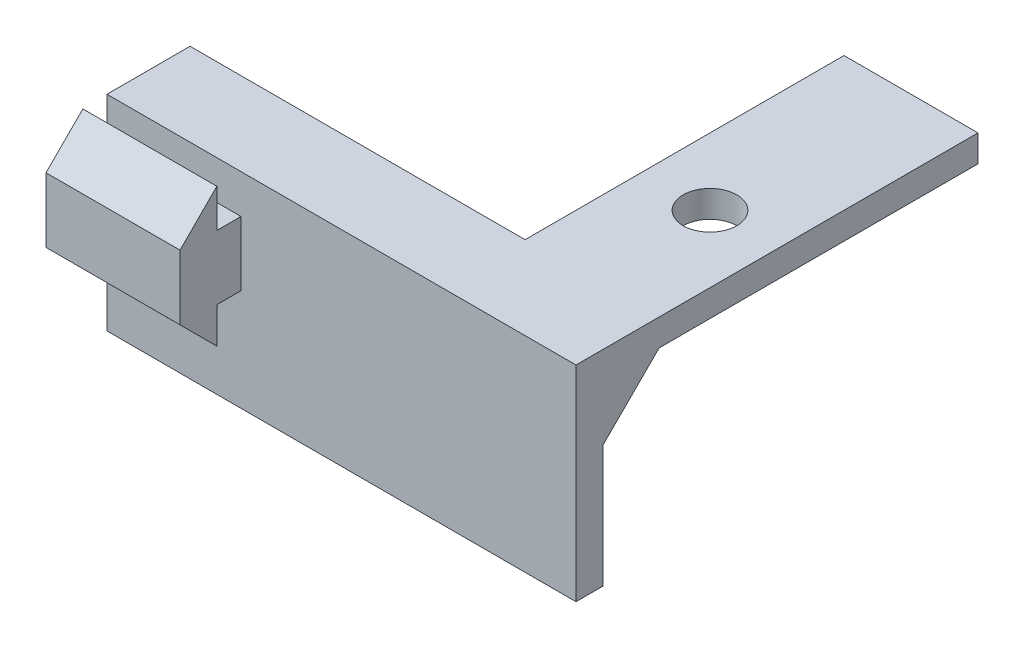
ISO-10303-21;
HEADER;
FILE_DESCRIPTION(('STEP AP214'),'2;1');
FILE_NAME('part.step','',(''),(''),'','','');
FILE_SCHEMA(('AUTOMOTIVE_DESIGN { 1 0 10303 214 1 1 1 1 }'));
ENDSEC;
DATA;
#1=APPLICATION_CONTEXT('core data for automotive mechanical design processes');
#2=APPLICATION_PROTOCOL_DEFINITION('international standard','automotive_design',2000,#1);
#3=PRODUCT_CONTEXT('',#1,'mechanical');
#4=PRODUCT('Part','Part','',(#3));
#5=PRODUCT_RELATED_PRODUCT_CATEGORY('part','',(#4));
#6=PRODUCT_DEFINITION_FORMATION('','',#4);
#7=PRODUCT_DEFINITION_CONTEXT('part definition',#1,'design');
#8=PRODUCT_DEFINITION('design','',#6,#7);
#9=PRODUCT_DEFINITION_SHAPE('','',#8);
#10=(LENGTH_UNIT() NAMED_UNIT(*) SI_UNIT(.MILLI.,.METRE.));
#11=(NAMED_UNIT(*) PLANE_ANGLE_UNIT() SI_UNIT($,.RADIAN.));
#12=(NAMED_UNIT(*) SI_UNIT($,.STERADIAN.) SOLID_ANGLE_UNIT());
#13=UNCERTAINTY_MEASURE_WITH_UNIT(LENGTH_MEASURE(1.E-05),#10,'distance_accuracy_value','');
#14=(GEOMETRIC_REPRESENTATION_CONTEXT(3) GLOBAL_UNCERTAINTY_ASSIGNED_CONTEXT((#13)) GLOBAL_UNIT_ASSIGNED_CONTEXT((#10,
#11,#12)) REPRESENTATION_CONTEXT('',''));
#15=CARTESIAN_POINT('',(0.,0.,0.));
#16=DIRECTION('',(0.,0.,1.));
#17=DIRECTION('',(1.,0.,0.));
#18=AXIS2_PLACEMENT_3D('',#15,#16,#17);
#19=CARTESIAN_POINT('',(-25.,7.60000000000001,0.));
#20=DIRECTION('',(0.,-1.,0.));
#21=DIRECTION('',(0.,0.,-1.));
#22=AXIS2_PLACEMENT_3D('',#19,#20,#21);
#23=PLANE('',#22);
#24=DIRECTION('',(1.,0.,0.));
#25=VECTOR('',#24,1.);
#26=CARTESIAN_POINT('',(-25.,7.60000000000001,0.));
#27=LINE('',#26,#25);
#28=CARTESIAN_POINT('',(-25.,7.60000000000001,0.));
#29=VERTEX_POINT('',#28);
#30=CARTESIAN_POINT('',(-15.,7.60000000000001,0.));
#31=VERTEX_POINT('',#30);
#32=EDGE_CURVE('E158',#29,#31,#27,.T.);
#33=ORIENTED_EDGE('',*,*,#32,.T.);
#34=DIRECTION('',(0.,0.,-1.));
#35=VECTOR('',#34,1.);
#36=CARTESIAN_POINT('',(-15.,7.60000000000001,0.));
#37=LINE('',#36,#35);
#38=CARTESIAN_POINT('',(-15.,7.60000000000001,1.8));
#39=VERTEX_POINT('',#38);
#40=EDGE_CURVE('E313',#39,#31,#37,.T.);
#41=ORIENTED_EDGE('',*,*,#40,.F.);
#42=DIRECTION('',(1.,0.,0.));
#43=VECTOR('',#42,1.);
#44=CARTESIAN_POINT('',(-25.,7.60000000000001,1.8));
#45=LINE('',#44,#43);
#46=CARTESIAN_POINT('',(-25.,7.60000000000001,1.8));
#47=VERTEX_POINT('',#46);
#48=EDGE_CURVE('E155',#47,#39,#45,.T.);
#49=ORIENTED_EDGE('',*,*,#48,.F.);
#50=DIRECTION('',(0.,0.,-1.));
#51=VECTOR('',#50,1.);
#52=CARTESIAN_POINT('',(-25.,7.60000000000001,0.));
#53=LINE('',#52,#51);
#54=EDGE_CURVE('E294',#47,#29,#53,.T.);
#55=ORIENTED_EDGE('',*,*,#54,.T.);
#56=EDGE_LOOP('',(#33,#41,#49,#55));
#57=FACE_BOUND('',#56,.T.);
#58=ADVANCED_FACE('F35',(#57),#23,.T.);
#59=CARTESIAN_POINT('',(-25.,0.,1.8));
#60=DIRECTION('',(0.,0.,1.));
#61=DIRECTION('',(0.,-1.,0.));
#62=AXIS2_PLACEMENT_3D('',#59,#60,#61);
#63=PLANE('',#62);
#64=DIRECTION('',(0.,-1.,0.));
#65=VECTOR('',#64,1.);
#66=CARTESIAN_POINT('',(-15.,0.,1.8));
#67=LINE('',#66,#65);
#68=CARTESIAN_POINT('',(-15.,4.92168062195145,1.8));
#69=VERTEX_POINT('',#68);
#70=EDGE_CURVE('E501',#39,#69,#67,.T.);
#71=ORIENTED_EDGE('',*,*,#70,.T.);
#72=DIRECTION('',(1.,0.,0.));
#73=VECTOR('',#72,1.);
#74=CARTESIAN_POINT('',(-25.,4.92168062195145,1.8));
#75=LINE('',#74,#73);
#76=CARTESIAN_POINT('',(-25.,4.92168062195145,1.8));
#77=VERTEX_POINT('',#76);
#78=EDGE_CURVE('E159',#77,#69,#75,.T.);
#79=ORIENTED_EDGE('',*,*,#78,.F.);
#80=DIRECTION('',(0.,-1.,0.));
#81=VECTOR('',#80,1.);
#82=CARTESIAN_POINT('',(-25.,0.,1.8));
#83=LINE('',#82,#81);
#84=EDGE_CURVE('E291',#47,#77,#83,.T.);
#85=ORIENTED_EDGE('',*,*,#84,.F.);
#86=ORIENTED_EDGE('',*,*,#48,.T.);
#87=EDGE_LOOP('',(#71,#79,#85,#86));
#88=FACE_BOUND('',#87,.T.);
#89=ADVANCED_FACE('F221',(#88),#63,.F.);
#90=CARTESIAN_POINT('',(-25.,1.56084031097572,-1.56084031097572));
#91=DIRECTION('',(0.,0.707106781186548,-0.707106781186548));
#92=DIRECTION('',(0.,0.707106781186548,0.707106781186548));
#93=AXIS2_PLACEMENT_3D('',#90,#91,#92);
#94=PLANE('',#93);
#95=DIRECTION('',(0.,0.707106781186548,0.707106781186548));
#96=VECTOR('',#95,1.);
#97=CARTESIAN_POINT('',(-15.,1.56084031097572,-1.56084031097572));
#98=LINE('',#97,#96);
#99=CARTESIAN_POINT('',(-15.,7.6716806219514,4.54999999999995));
#100=VERTEX_POINT('',#99);
#101=EDGE_CURVE('E148',#69,#100,#98,.T.);
#102=ORIENTED_EDGE('',*,*,#101,.T.);
#103=DIRECTION('',(1.,0.,0.));
#104=VECTOR('',#103,1.);
#105=CARTESIAN_POINT('',(-25.,7.6716806219514,4.54999999999995));
#106=LINE('',#105,#104);
#107=CARTESIAN_POINT('',(-25.,7.6716806219514,4.54999999999995));
#108=VERTEX_POINT('',#107);
#109=EDGE_CURVE('E162',#108,#100,#106,.T.);
#110=ORIENTED_EDGE('',*,*,#109,.F.);
#111=DIRECTION('',(0.,0.707106781186548,0.707106781186548));
#112=VECTOR('',#111,1.);
#113=CARTESIAN_POINT('',(-25.,1.56084031097572,-1.56084031097572));
#114=LINE('',#113,#112);
#115=EDGE_CURVE('E288',#77,#108,#114,.T.);
#116=ORIENTED_EDGE('',*,*,#115,.F.);
#117=ORIENTED_EDGE('',*,*,#78,.T.);
#118=EDGE_LOOP('',(#102,#110,#116,#117));
#119=FACE_BOUND('',#118,.T.);
#120=ADVANCED_FACE('F227',(#119),#94,.F.);
#121=CARTESIAN_POINT('',(-25.,0.,4.54999999999995));
#122=DIRECTION('',(0.,0.,1.));
#123=DIRECTION('',(0.,-1.,0.));
#124=AXIS2_PLACEMENT_3D('',#121,#122,#123);
#125=PLANE('',#124);
#126=ORIENTED_EDGE('',*,*,#109,.T.);
#127=DIRECTION('',(0.,-1.,0.));
#128=VECTOR('',#127,1.);
#129=CARTESIAN_POINT('',(-15.,0.,4.54999999999995));
#130=LINE('',#129,#128);
#131=CARTESIAN_POINT('',(-15.,12.5,4.54999999999996));
#132=VERTEX_POINT('',#131);
#133=EDGE_CURVE('E518',#132,#100,#130,.T.);
#134=ORIENTED_EDGE('',*,*,#133,.F.);
#135=DIRECTION('',(1.,0.,0.));
#136=VECTOR('',#135,1.);
#137=CARTESIAN_POINT('',(-25.,12.5,4.54999999999996));
#138=LINE('',#137,#136);
#139=CARTESIAN_POINT('',(-25.,12.5,4.54999999999996));
#140=VERTEX_POINT('',#139);
#141=EDGE_CURVE('E165',#140,#132,#138,.T.);
#142=ORIENTED_EDGE('',*,*,#141,.F.);
#143=DIRECTION('',(0.,-1.,0.));
#144=VECTOR('',#143,1.);
#145=CARTESIAN_POINT('',(-25.,0.,4.54999999999995));
#146=LINE('',#145,#144);
#147=EDGE_CURVE('E285',#140,#108,#146,.T.);
#148=ORIENTED_EDGE('',*,*,#147,.T.);
#149=EDGE_LOOP('',(#126,#134,#142,#148));
#150=FACE_BOUND('',#149,.T.);
#151=ADVANCED_FACE('F237',(#150),#125,.T.);
#152=CARTESIAN_POINT('',(-25.,8.52499999999992,8.52500000000001));
#153=DIRECTION('',(0.,0.707106781186544,0.707106781186551));
#154=DIRECTION('',(0.,-0.707106781186551,0.707106781186544));
#155=AXIS2_PLACEMENT_3D('',#152,#153,#154);
#156=PLANE('',#155);
#157=ORIENTED_EDGE('',*,*,#141,.T.);
#158=DIRECTION('',(0.,-0.707106781186551,0.707106781186544));
#159=VECTOR('',#158,1.);
#160=CARTESIAN_POINT('',(-15.,8.52499999999992,8.52500000000001));
#161=LINE('',#160,#159);
#162=CARTESIAN_POINT('',(-15.,15.25,1.8));
#163=VERTEX_POINT('',#162);
#164=EDGE_CURVE('E515',#163,#132,#161,.T.);
#165=ORIENTED_EDGE('',*,*,#164,.F.);
#166=DIRECTION('',(1.,0.,0.));
#167=VECTOR('',#166,1.);
#168=CARTESIAN_POINT('',(-25.,15.25,1.8));
#169=LINE('',#168,#167);
#170=CARTESIAN_POINT('',(-25.,15.25,1.8));
#171=VERTEX_POINT('',#170);
#172=EDGE_CURVE('E168',#171,#163,#169,.T.);
#173=ORIENTED_EDGE('',*,*,#172,.F.);
#174=DIRECTION('',(0.,-0.707106781186551,0.707106781186544));
#175=VECTOR('',#174,1.);
#176=CARTESIAN_POINT('',(-25.,8.52499999999992,8.52500000000001));
#177=LINE('',#176,#175);
#178=EDGE_CURVE('E282',#171,#140,#177,.T.);
#179=ORIENTED_EDGE('',*,*,#178,.T.);
#180=EDGE_LOOP('',(#157,#165,#173,#179));
#181=FACE_BOUND('',#180,.T.);
#182=ADVANCED_FACE('F241',(#181),#156,.T.);
#183=CARTESIAN_POINT('',(-25.,0.,1.8));
#184=DIRECTION('',(0.,0.,-1.));
#185=DIRECTION('',(-1.,0.,0.));
#186=AXIS2_PLACEMENT_3D('',#183,#184,#185);
#187=PLANE('',#186);
#188=ORIENTED_EDGE('',*,*,#172,.T.);
#189=DIRECTION('',(0.,1.,0.));
#190=VECTOR('',#189,1.);
#191=CARTESIAN_POINT('',(-15.,0.,1.8));
#192=LINE('',#191,#190);
#193=CARTESIAN_POINT('',(-15.,12.4,1.8));
#194=VERTEX_POINT('',#193);
#195=EDGE_CURVE('E512',#194,#163,#192,.T.);
#196=ORIENTED_EDGE('',*,*,#195,.F.);
#197=DIRECTION('',(1.,0.,0.));
#198=VECTOR('',#197,1.);
#199=CARTESIAN_POINT('',(-25.,12.4,1.8));
#200=LINE('',#199,#198);
#201=CARTESIAN_POINT('',(-25.,12.4,1.8));
#202=VERTEX_POINT('',#201);
#203=EDGE_CURVE('E171',#202,#194,#200,.T.);
#204=ORIENTED_EDGE('',*,*,#203,.F.);
#205=DIRECTION('',(0.,1.,0.));
#206=VECTOR('',#205,1.);
#207=CARTESIAN_POINT('',(-25.,0.,1.8));
#208=LINE('',#207,#206);
#209=EDGE_CURVE('E279',#202,#171,#208,.T.);
#210=ORIENTED_EDGE('',*,*,#209,.T.);
#211=EDGE_LOOP('',(#188,#196,#204,#210));
#212=FACE_BOUND('',#211,.T.);
#213=ADVANCED_FACE('F245',(#212),#187,.T.);
#214=CARTESIAN_POINT('',(-25.,12.4,0.));
#215=DIRECTION('',(0.,-1.,0.));
#216=DIRECTION('',(0.,0.,-1.));
#217=AXIS2_PLACEMENT_3D('',#214,#215,#216);
#218=PLANE('',#217);
#219=DIRECTION('',(0.,0.,-1.));
#220=VECTOR('',#219,1.);
#221=CARTESIAN_POINT('',(-15.,12.4,0.));
#222=LINE('',#221,#220);
#223=CARTESIAN_POINT('',(-15.,12.4,0.));
#224=VERTEX_POINT('',#223);
#225=EDGE_CURVE('E509',#194,#224,#222,.T.);
#226=ORIENTED_EDGE('',*,*,#225,.T.);
#227=DIRECTION('',(1.,0.,0.));
#228=VECTOR('',#227,1.);
#229=CARTESIAN_POINT('',(-25.,12.4,0.));
#230=LINE('',#229,#228);
#231=CARTESIAN_POINT('',(-25.,12.4,0.));
#232=VERTEX_POINT('',#231);
#233=EDGE_CURVE('E174',#232,#224,#230,.T.);
#234=ORIENTED_EDGE('',*,*,#233,.F.);
#235=DIRECTION('',(0.,0.,-1.));
#236=VECTOR('',#235,1.);
#237=CARTESIAN_POINT('',(-25.,12.4,0.));
#238=LINE('',#237,#236);
#239=EDGE_CURVE('E276',#202,#232,#238,.T.);
#240=ORIENTED_EDGE('',*,*,#239,.F.);
#241=ORIENTED_EDGE('',*,*,#203,.T.);
#242=EDGE_LOOP('',(#226,#234,#240,#241));
#243=FACE_BOUND('',#242,.T.);
#244=ADVANCED_FACE('F249',(#243),#218,.F.);
#245=CARTESIAN_POINT('',(10.,3.55000000000001,3.55000000000001));
#246=DIRECTION('',(0.,0.707106781186547,0.707106781186548));
#247=DIRECTION('',(0.,-0.707106781186548,0.707106781186547));
#248=AXIS2_PLACEMENT_3D('',#245,#246,#247);
#249=PLANE('',#248);
#250=DIRECTION('',(-1.,0.,0.));
#251=VECTOR('',#250,1.);
#252=CARTESIAN_POINT('',(10.,9.10000000000002,-2.));
#253=LINE('',#252,#251);
#254=CARTESIAN_POINT('',(10.,9.10000000000002,-2.));
#255=VERTEX_POINT('',#254);
#256=CARTESIAN_POINT('',(-25.,9.10000000000002,-2.));
#257=VERTEX_POINT('',#256);
#258=EDGE_CURVE('E128',#255,#257,#253,.T.);
#259=ORIENTED_EDGE('',*,*,#258,.T.);
#260=DIRECTION('',(0.,0.707106781186548,-0.707106781186547));
#261=VECTOR('',#260,1.);
#262=CARTESIAN_POINT('',(-25.,3.55000000000001,3.55000000000001));
#263=LINE('',#262,#261);
#264=CARTESIAN_POINT('',(-25.,13.3,-6.19999999999998));
#265=VERTEX_POINT('',#264);
#266=EDGE_CURVE('E147',#257,#265,#263,.T.);
#267=ORIENTED_EDGE('',*,*,#266,.T.);
#268=DIRECTION('',(1.,0.,0.));
#269=VECTOR('',#268,1.);
#270=CARTESIAN_POINT('',(-25.,13.3,-6.19999999999998));
#271=LINE('',#270,#269);
#272=CARTESIAN_POINT('',(0.,13.3,-6.19999999999998));
#273=VERTEX_POINT('',#272);
#274=EDGE_CURVE('E175',#265,#273,#271,.T.);
#275=ORIENTED_EDGE('',*,*,#274,.T.);
#276=DIRECTION('',(-1.,0.,0.));
#277=VECTOR('',#276,1.);
#278=CARTESIAN_POINT('',(10.,13.3,-6.19999999999998));
#279=LINE('',#278,#277);
#280=CARTESIAN_POINT('',(10.,13.3,-6.19999999999998));
#281=VERTEX_POINT('',#280);
#282=EDGE_CURVE('E11',#281,#273,#279,.T.);
#283=ORIENTED_EDGE('',*,*,#282,.F.);
#284=DIRECTION('',(0.,0.707106781186548,-0.707106781186547));
#285=VECTOR('',#284,1.);
#286=CARTESIAN_POINT('',(10.,3.55000000000001,3.55000000000001));
#287=LINE('',#286,#285);
#288=EDGE_CURVE('E83',#255,#281,#287,.T.);
#289=ORIENTED_EDGE('',*,*,#288,.F.);
#290=EDGE_LOOP('',(#259,#267,#275,#283,#289));
#291=FACE_BOUND('',#290,.T.);
#292=ADVANCED_FACE('F37',(#291),#249,.F.);
#293=CARTESIAN_POINT('',(10.,13.3,0.));
#294=DIRECTION('',(0.,-1.,0.));
#295=DIRECTION('',(0.,0.,-1.));
#296=AXIS2_PLACEMENT_3D('',#293,#294,#295);
#297=PLANE('',#296);
#298=CARTESIAN_POINT('',(5.,13.3,-15.));
#299=DIRECTION('',(0.,-1.,0.));
#300=DIRECTION('',(0.,0.,-1.));
#301=AXIS2_PLACEMENT_3D('',#298,#299,#300);
#302=CIRCLE('',#301,2.);
#303=CARTESIAN_POINT('',(5.,13.3,-17.));
#304=VERTEX_POINT('',#303);
#305=EDGE_CURVE('E136',#304,#304,#302,.T.);
#306=ORIENTED_EDGE('',*,*,#305,.F.);
#307=EDGE_LOOP('',(#306));
#308=FACE_BOUND('',#307,.T.);
#309=DIRECTION('',(0.,0.,1.));
#310=VECTOR('',#309,1.);
#311=CARTESIAN_POINT('',(0.,13.3,0.));
#312=LINE('',#311,#310);
#313=CARTESIAN_POINT('',(0.,13.3,-30.));
#314=VERTEX_POINT('',#313);
#315=EDGE_CURVE('E132',#314,#273,#312,.T.);
#316=ORIENTED_EDGE('',*,*,#315,.F.);
#317=DIRECTION('',(-1.,0.,0.));
#318=VECTOR('',#317,1.);
#319=CARTESIAN_POINT('',(10.,13.3,-30.));
#320=LINE('',#319,#318);
#321=CARTESIAN_POINT('',(10.,13.3,-30.));
#322=VERTEX_POINT('',#321);
#323=EDGE_CURVE('E44',#322,#314,#320,.T.);
#324=ORIENTED_EDGE('',*,*,#323,.F.);
#325=DIRECTION('',(0.,0.,1.));
#326=VECTOR('',#325,1.);
#327=CARTESIAN_POINT('',(10.,13.3,0.));
#328=LINE('',#327,#326);
#329=EDGE_CURVE('E184',#322,#281,#328,.T.);
#330=ORIENTED_EDGE('',*,*,#329,.T.);
#331=ORIENTED_EDGE('',*,*,#282,.T.);
#332=EDGE_LOOP('',(#316,#324,#330,#331));
#333=FACE_BOUND('',#332,.T.);
#334=ADVANCED_FACE('F205',(#308,#333),#297,.T.);
#335=CARTESIAN_POINT('',(10.,1.04083408558609E-13,-30.));
#336=DIRECTION('',(0.,0.,-1.));
#337=DIRECTION('',(0.,1.,0.));
#338=AXIS2_PLACEMENT_3D('',#335,#336,#337);
#339=PLANE('',#338);
#340=DIRECTION('',(0.,-1.,0.));
#341=VECTOR('',#340,1.);
#342=CARTESIAN_POINT('',(0.,1.04083408558609E-13,-30.));
#343=LINE('',#342,#341);
#344=CARTESIAN_POINT('',(0.,15.3,-30.));
#345=VERTEX_POINT('',#344);
#346=EDGE_CURVE('E135',#345,#314,#343,.T.);
#347=ORIENTED_EDGE('',*,*,#346,.F.);
#348=DIRECTION('',(-1.,0.,0.));
#349=VECTOR('',#348,1.);
#350=CARTESIAN_POINT('',(10.,15.3,-30.));
#351=LINE('',#350,#349);
#352=CARTESIAN_POINT('',(10.,15.3,-30.));
#353=VERTEX_POINT('',#352);
#354=EDGE_CURVE('E191',#353,#345,#351,.T.);
#355=ORIENTED_EDGE('',*,*,#354,.F.);
#356=DIRECTION('',(0.,-1.,0.));
#357=VECTOR('',#356,1.);
#358=CARTESIAN_POINT('',(10.,1.04083408558609E-13,-30.));
#359=LINE('',#358,#357);
#360=EDGE_CURVE('E187',#353,#322,#359,.T.);
#361=ORIENTED_EDGE('',*,*,#360,.T.);
#362=ORIENTED_EDGE('',*,*,#323,.T.);
#363=EDGE_LOOP('',(#347,#355,#361,#362));
#364=FACE_BOUND('',#363,.T.);
#365=ADVANCED_FACE('F203',(#364),#339,.T.);
#366=CARTESIAN_POINT('',(10.,15.3,0.));
#367=DIRECTION('',(0.,1.,0.));
#368=DIRECTION('',(0.,0.,1.));
#369=AXIS2_PLACEMENT_3D('',#366,#367,#368);
#370=PLANE('',#369);
#371=CARTESIAN_POINT('',(5.,15.3,-15.));
#372=DIRECTION('',(0.,1.,0.));
#373=DIRECTION('',(0.,0.,1.));
#374=AXIS2_PLACEMENT_3D('',#371,#372,#373);
#375=CIRCLE('',#374,2.);
#376=CARTESIAN_POINT('',(5.,15.3,-13.));
#377=VERTEX_POINT('',#376);
#378=EDGE_CURVE('E178',#377,#377,#375,.T.);
#379=ORIENTED_EDGE('',*,*,#378,.F.);
#380=EDGE_LOOP('',(#379));
#381=FACE_BOUND('',#380,.T.);
#382=DIRECTION('',(0.,0.,-1.));
#383=VECTOR('',#382,1.);
#384=CARTESIAN_POINT('',(0.,15.3,0.));
#385=LINE('',#384,#383);
#386=CARTESIAN_POINT('',(0.,15.3,-6.19999999999998));
#387=VERTEX_POINT('',#386);
#388=EDGE_CURVE('E77',#387,#345,#385,.T.);
#389=ORIENTED_EDGE('',*,*,#388,.F.);
#390=DIRECTION('',(1.,0.,0.));
#391=VECTOR('',#390,1.);
#392=CARTESIAN_POINT('',(-25.,15.3,-6.19999999999998));
#393=LINE('',#392,#391);
#394=CARTESIAN_POINT('',(-25.,15.3,-6.19999999999998));
#395=VERTEX_POINT('',#394);
#396=EDGE_CURVE('E52',#395,#387,#393,.T.);
#397=ORIENTED_EDGE('',*,*,#396,.F.);
#398=DIRECTION('',(0.,0.,-1.));
#399=VECTOR('',#398,1.);
#400=CARTESIAN_POINT('',(-25.,15.3,0.));
#401=LINE('',#400,#399);
#402=CARTESIAN_POINT('',(-25.,15.3,0.));
#403=VERTEX_POINT('',#402);
#404=EDGE_CURVE('E196',#403,#395,#401,.T.);
#405=ORIENTED_EDGE('',*,*,#404,.F.);
#406=DIRECTION('',(-1.,0.,0.));
#407=VECTOR('',#406,1.);
#408=CARTESIAN_POINT('',(10.,15.3,0.));
#409=LINE('',#408,#407);
#410=CARTESIAN_POINT('',(10.,15.3,0.));
#411=VERTEX_POINT('',#410);
#412=EDGE_CURVE('E115',#411,#403,#409,.T.);
#413=ORIENTED_EDGE('',*,*,#412,.F.);
#414=DIRECTION('',(0.,0.,-1.));
#415=VECTOR('',#414,1.);
#416=CARTESIAN_POINT('',(10.,15.3,0.));
#417=LINE('',#416,#415);
#418=EDGE_CURVE('E123',#411,#353,#417,.T.);
#419=ORIENTED_EDGE('',*,*,#418,.T.);
#420=ORIENTED_EDGE('',*,*,#354,.T.);
#421=EDGE_LOOP('',(#389,#397,#405,#413,#419,#420));
#422=FACE_BOUND('',#421,.T.);
#423=ADVANCED_FACE('F190',(#381,#422),#370,.T.);
#424=CARTESIAN_POINT('',(10.,0.,0.));
#425=DIRECTION('',(0.,0.,1.));
#426=DIRECTION('',(1.,0.,0.));
#427=AXIS2_PLACEMENT_3D('',#424,#425,#426);
#428=PLANE('',#427);
#429=ORIENTED_EDGE('',*,*,#233,.T.);
#430=DIRECTION('',(0.,1.,0.));
#431=VECTOR('',#430,1.);
#432=CARTESIAN_POINT('',(-15.,0.,0.));
#433=LINE('',#432,#431);
#434=EDGE_CURVE('E306',#31,#224,#433,.T.);
#435=ORIENTED_EDGE('',*,*,#434,.F.);
#436=ORIENTED_EDGE('',*,*,#32,.F.);
#437=DIRECTION('',(0.,1.,0.));
#438=VECTOR('',#437,1.);
#439=CARTESIAN_POINT('',(-25.,0.,0.));
#440=LINE('',#439,#438);
#441=CARTESIAN_POINT('',(-25.,0.,0.));
#442=VERTEX_POINT('',#441);
#443=EDGE_CURVE('E110',#442,#29,#440,.T.);
#444=ORIENTED_EDGE('',*,*,#443,.F.);
#445=DIRECTION('',(-1.,0.,0.));
#446=VECTOR('',#445,1.);
#447=CARTESIAN_POINT('',(10.,0.,0.));
#448=LINE('',#447,#446);
#449=CARTESIAN_POINT('',(10.,0.,0.));
#450=VERTEX_POINT('',#449);
#451=EDGE_CURVE('E101',#450,#442,#448,.T.);
#452=ORIENTED_EDGE('',*,*,#451,.F.);
#453=DIRECTION('',(0.,1.,0.));
#454=VECTOR('',#453,1.);
#455=CARTESIAN_POINT('',(10.,0.,0.));
#456=LINE('',#455,#454);
#457=EDGE_CURVE('E106',#450,#411,#456,.T.);
#458=ORIENTED_EDGE('',*,*,#457,.T.);
#459=ORIENTED_EDGE('',*,*,#412,.T.);
#460=EDGE_CURVE('E270',#232,#403,#440,.T.);
#461=ORIENTED_EDGE('',*,*,#460,.F.);
#462=EDGE_LOOP('',(#429,#435,#436,#444,#452,#458,#459,#461));
#463=FACE_BOUND('',#462,.T.);
#464=ADVANCED_FACE('F104',(#463),#428,.T.);
#465=CARTESIAN_POINT('',(10.,0.,0.));
#466=DIRECTION('',(0.,-1.,0.));
#467=DIRECTION('',(0.,0.,-1.));
#468=AXIS2_PLACEMENT_3D('',#465,#466,#467);
#469=PLANE('',#468);
#470=ORIENTED_EDGE('',*,*,#451,.T.);
#471=DIRECTION('',(0.,0.,1.));
#472=VECTOR('',#471,1.);
#473=CARTESIAN_POINT('',(-25.,0.,0.));
#474=LINE('',#473,#472);
#475=CARTESIAN_POINT('',(-25.,0.,-2.));
#476=VERTEX_POINT('',#475);
#477=EDGE_CURVE('E296',#476,#442,#474,.T.);
#478=ORIENTED_EDGE('',*,*,#477,.F.);
#479=DIRECTION('',(-1.,0.,0.));
#480=VECTOR('',#479,1.);
#481=CARTESIAN_POINT('',(10.,0.,-2.));
#482=LINE('',#481,#480);
#483=CARTESIAN_POINT('',(10.,0.,-2.));
#484=VERTEX_POINT('',#483);
#485=EDGE_CURVE('E116',#484,#476,#482,.T.);
#486=ORIENTED_EDGE('',*,*,#485,.F.);
#487=DIRECTION('',(0.,0.,1.));
#488=VECTOR('',#487,1.);
#489=CARTESIAN_POINT('',(10.,0.,0.));
#490=LINE('',#489,#488);
#491=EDGE_CURVE('E120',#484,#450,#490,.T.);
#492=ORIENTED_EDGE('',*,*,#491,.T.);
#493=EDGE_LOOP('',(#470,#478,#486,#492));
#494=FACE_BOUND('',#493,.T.);
#495=ADVANCED_FACE('F125',(#494),#469,.T.);
#496=CARTESIAN_POINT('',(10.,0.,-2.));
#497=DIRECTION('',(0.,0.,1.));
#498=DIRECTION('',(1.,0.,0.));
#499=AXIS2_PLACEMENT_3D('',#496,#497,#498);
#500=PLANE('',#499);
#501=ORIENTED_EDGE('',*,*,#485,.T.);
#502=DIRECTION('',(0.,1.,0.));
#503=VECTOR('',#502,1.);
#504=CARTESIAN_POINT('',(-25.,0.,-2.));
#505=LINE('',#504,#503);
#506=EDGE_CURVE('E153',#476,#257,#505,.T.);
#507=ORIENTED_EDGE('',*,*,#506,.T.);
#508=ORIENTED_EDGE('',*,*,#258,.F.);
#509=DIRECTION('',(0.,1.,0.));
#510=VECTOR('',#509,1.);
#511=CARTESIAN_POINT('',(10.,0.,-2.));
#512=LINE('',#511,#510);
#513=EDGE_CURVE('E61',#484,#255,#512,.T.);
#514=ORIENTED_EDGE('',*,*,#513,.F.);
#515=EDGE_LOOP('',(#501,#507,#508,#514));
#516=FACE_BOUND('',#515,.T.);
#517=ADVANCED_FACE('F217',(#516),#500,.F.);
#518=CARTESIAN_POINT('',(10.,0.,0.));
#519=DIRECTION('',(1.,0.,0.));
#520=DIRECTION('',(0.,0.,-1.));
#521=AXIS2_PLACEMENT_3D('',#518,#519,#520);
#522=PLANE('',#521);
#523=ORIENTED_EDGE('',*,*,#288,.T.);
#524=ORIENTED_EDGE('',*,*,#329,.F.);
#525=ORIENTED_EDGE('',*,*,#360,.F.);
#526=ORIENTED_EDGE('',*,*,#418,.F.);
#527=ORIENTED_EDGE('',*,*,#457,.F.);
#528=ORIENTED_EDGE('',*,*,#491,.F.);
#529=ORIENTED_EDGE('',*,*,#513,.T.);
#530=EDGE_LOOP('',(#523,#524,#525,#526,#527,#528,#529));
#531=FACE_BOUND('',#530,.T.);
#532=ADVANCED_FACE('F119',(#531),#522,.T.);
#533=CARTESIAN_POINT('',(0.,0.,0.));
#534=DIRECTION('',(1.,0.,0.));
#535=DIRECTION('',(0.,0.,-1.));
#536=AXIS2_PLACEMENT_3D('',#533,#534,#535);
#537=PLANE('',#536);
#538=ORIENTED_EDGE('',*,*,#315,.T.);
#539=DIRECTION('',(0.,1.,0.));
#540=VECTOR('',#539,1.);
#541=CARTESIAN_POINT('',(0.,0.,-6.19999999999998));
#542=LINE('',#541,#540);
#543=EDGE_CURVE('E144',#273,#387,#542,.T.);
#544=ORIENTED_EDGE('',*,*,#543,.T.);
#545=ORIENTED_EDGE('',*,*,#388,.T.);
#546=ORIENTED_EDGE('',*,*,#346,.T.);
#547=EDGE_LOOP('',(#538,#544,#545,#546));
#548=FACE_BOUND('',#547,.T.);
#549=ADVANCED_FACE('F206',(#548),#537,.F.);
#550=CARTESIAN_POINT('',(5.,12.3,-15.));
#551=DIRECTION('',(0.,1.,0.));
#552=DIRECTION('',(0.,0.,1.));
#553=AXIS2_PLACEMENT_3D('',#550,#551,#552);
#554=CYLINDRICAL_SURFACE('',#553,2.);
#555=ORIENTED_EDGE('',*,*,#305,.T.);
#556=EDGE_LOOP('',(#555));
#557=FACE_BOUND('',#556,.T.);
#558=ORIENTED_EDGE('',*,*,#378,.T.);
#559=EDGE_LOOP('',(#558));
#560=FACE_BOUND('',#559,.T.);
#561=ADVANCED_FACE('F208',(#557,#560),#554,.F.);
#562=CARTESIAN_POINT('',(-25.,0.,-6.19999999999998));
#563=DIRECTION('',(0.,0.,-1.));
#564=DIRECTION('',(-1.,0.,0.));
#565=AXIS2_PLACEMENT_3D('',#562,#563,#564);
#566=PLANE('',#565);
#567=ORIENTED_EDGE('',*,*,#543,.F.);
#568=ORIENTED_EDGE('',*,*,#274,.F.);
#569=DIRECTION('',(0.,1.,0.));
#570=VECTOR('',#569,1.);
#571=CARTESIAN_POINT('',(-25.,0.,-6.19999999999998));
#572=LINE('',#571,#570);
#573=EDGE_CURVE('E266',#265,#395,#572,.T.);
#574=ORIENTED_EDGE('',*,*,#573,.T.);
#575=ORIENTED_EDGE('',*,*,#396,.T.);
#576=EDGE_LOOP('',(#567,#568,#574,#575));
#577=FACE_BOUND('',#576,.T.);
#578=ADVANCED_FACE('F214',(#577),#566,.T.);
#579=CARTESIAN_POINT('',(-25.,0.,0.));
#580=DIRECTION('',(1.,0.,0.));
#581=DIRECTION('',(0.,0.,-1.));
#582=AXIS2_PLACEMENT_3D('',#579,#580,#581);
#583=PLANE('',#582);
#584=ORIENTED_EDGE('',*,*,#266,.F.);
#585=ORIENTED_EDGE('',*,*,#506,.F.);
#586=ORIENTED_EDGE('',*,*,#477,.T.);
#587=ORIENTED_EDGE('',*,*,#443,.T.);
#588=ORIENTED_EDGE('',*,*,#54,.F.);
#589=ORIENTED_EDGE('',*,*,#84,.T.);
#590=ORIENTED_EDGE('',*,*,#115,.T.);
#591=ORIENTED_EDGE('',*,*,#147,.F.);
#592=ORIENTED_EDGE('',*,*,#178,.F.);
#593=ORIENTED_EDGE('',*,*,#209,.F.);
#594=ORIENTED_EDGE('',*,*,#239,.T.);
#595=ORIENTED_EDGE('',*,*,#460,.T.);
#596=ORIENTED_EDGE('',*,*,#404,.T.);
#597=ORIENTED_EDGE('',*,*,#573,.F.);
#598=EDGE_LOOP('',(#584,#585,#586,#587,#588,#589,#590,#591,#592,#593,#594,#595,#596,#597));
#599=FACE_BOUND('',#598,.T.);
#600=ADVANCED_FACE('F232',(#599),#583,.F.);
#601=CARTESIAN_POINT('',(-15.,0.,0.));
#602=DIRECTION('',(1.,0.,0.));
#603=DIRECTION('',(0.,0.,-1.));
#604=AXIS2_PLACEMENT_3D('',#601,#602,#603);
#605=PLANE('',#604);
#606=ORIENTED_EDGE('',*,*,#70,.F.);
#607=ORIENTED_EDGE('',*,*,#40,.T.);
#608=ORIENTED_EDGE('',*,*,#434,.T.);
#609=ORIENTED_EDGE('',*,*,#225,.F.);
#610=ORIENTED_EDGE('',*,*,#195,.T.);
#611=ORIENTED_EDGE('',*,*,#164,.T.);
#612=ORIENTED_EDGE('',*,*,#133,.T.);
#613=ORIENTED_EDGE('',*,*,#101,.F.);
#614=EDGE_LOOP('',(#606,#607,#608,#609,#610,#611,#612,#613));
#615=FACE_BOUND('',#614,.T.);
#616=ADVANCED_FACE('F258',(#615),#605,.T.);
#617=CLOSED_SHELL('',(#58,#89,#120,#151,#182,#213,#244,#292,#334,#365,#423,#464,#495,#517,#532,
#549,#561,#578,#600,#616));
#618=MANIFOLD_SOLID_BREP('B2',#617);
#619=ADVANCED_BREP_SHAPE_REPRESENTATION('',(#18,#618),#14);
#620=SHAPE_DEFINITION_REPRESENTATION(#9,#619);
ENDSEC;
END-ISO-10303-21;
